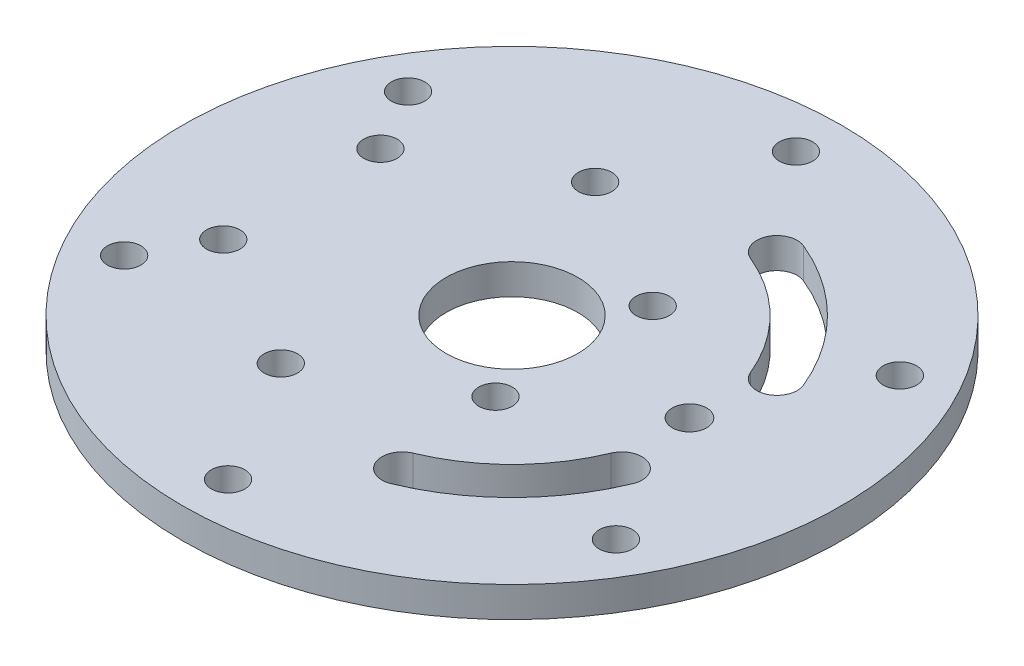
ISO-10303-21;
HEADER;
FILE_DESCRIPTION(('STEP AP214'),'2;1');
FILE_NAME('part.step','',(''),(''),'','','');
FILE_SCHEMA(('AUTOMOTIVE_DESIGN { 1 0 10303 214 1 1 1 1 }'));
ENDSEC;
DATA;
#1=APPLICATION_CONTEXT('core data for automotive mechanical design processes');
#2=APPLICATION_PROTOCOL_DEFINITION('international standard','automotive_design',2000,#1);
#3=PRODUCT_CONTEXT('',#1,'mechanical');
#4=PRODUCT('Part','Part','',(#3));
#5=PRODUCT_RELATED_PRODUCT_CATEGORY('part','',(#4));
#6=PRODUCT_DEFINITION_FORMATION('','',#4);
#7=PRODUCT_DEFINITION_CONTEXT('part definition',#1,'design');
#8=PRODUCT_DEFINITION('design','',#6,#7);
#9=PRODUCT_DEFINITION_SHAPE('','',#8);
#10=(LENGTH_UNIT() NAMED_UNIT(*) SI_UNIT(.MILLI.,.METRE.));
#11=(NAMED_UNIT(*) PLANE_ANGLE_UNIT() SI_UNIT($,.RADIAN.));
#12=(NAMED_UNIT(*) SI_UNIT($,.STERADIAN.) SOLID_ANGLE_UNIT());
#13=UNCERTAINTY_MEASURE_WITH_UNIT(LENGTH_MEASURE(1.E-05),#10,'distance_accuracy_value','');
#14=(GEOMETRIC_REPRESENTATION_CONTEXT(3) GLOBAL_UNCERTAINTY_ASSIGNED_CONTEXT((#13)) GLOBAL_UNIT_ASSIGNED_CONTEXT((#10,
#11,#12)) REPRESENTATION_CONTEXT('',''));
#15=CARTESIAN_POINT('',(0.,0.,0.));
#16=DIRECTION('',(0.,0.,1.));
#17=DIRECTION('',(1.,0.,0.));
#18=AXIS2_PLACEMENT_3D('',#15,#16,#17);
#19=CARTESIAN_POINT('',(0.,3.,0.));
#20=DIRECTION('',(0.,1.,0.));
#21=DIRECTION('',(0.,0.,1.));
#22=AXIS2_PLACEMENT_3D('',#19,#20,#21);
#23=PLANE('',#22);
#24=CARTESIAN_POINT('',(-24.2487113059625,3.,14.000000000001));
#25=DIRECTION('',(0.,1.,0.));
#26=DIRECTION('',(0.,0.,1.));
#27=AXIS2_PLACEMENT_3D('',#24,#25,#26);
#28=CIRCLE('',#27,1.65);
#29=CARTESIAN_POINT('',(-24.2487113059625,3.,15.650000000001));
#30=VERTEX_POINT('',#29);
#31=EDGE_CURVE('E177',#30,#30,#28,.T.);
#32=ORIENTED_EDGE('',*,*,#31,.F.);
#33=EDGE_LOOP('',(#32));
#34=FACE_BOUND('',#33,.T.);
#35=CARTESIAN_POINT('',(24.2487113059661,3.,13.999999999999));
#36=DIRECTION('',(0.,1.,0.));
#37=DIRECTION('',(0.,0.,1.));
#38=AXIS2_PLACEMENT_3D('',#35,#36,#37);
#39=CIRCLE('',#38,1.65);
#40=CARTESIAN_POINT('',(24.2487113059661,3.,15.649999999999));
#41=VERTEX_POINT('',#40);
#42=EDGE_CURVE('E189',#41,#41,#39,.T.);
#43=ORIENTED_EDGE('',*,*,#42,.F.);
#44=EDGE_LOOP('',(#43));
#45=FACE_BOUND('',#44,.T.);
#46=CARTESIAN_POINT('',(0.,3.,-28.));
#47=DIRECTION('',(0.,1.,0.));
#48=DIRECTION('',(0.,0.,1.));
#49=AXIS2_PLACEMENT_3D('',#46,#47,#48);
#50=CIRCLE('',#49,1.65);
#51=CARTESIAN_POINT('',(0.,3.,-26.35));
#52=VERTEX_POINT('',#51);
#53=EDGE_CURVE('E201',#52,#52,#50,.T.);
#54=ORIENTED_EDGE('',*,*,#53,.F.);
#55=EDGE_LOOP('',(#54));
#56=FACE_BOUND('',#55,.T.);
#57=CARTESIAN_POINT('',(-20.7233937586582,3.,-7.74999999999993));
#58=DIRECTION('',(0.,1.,0.));
#59=DIRECTION('',(0.,0.,1.));
#60=AXIS2_PLACEMENT_3D('',#57,#58,#59);
#61=CIRCLE('',#60,1.65);
#62=CARTESIAN_POINT('',(-20.7233937586582,3.,-6.09999999999993));
#63=VERTEX_POINT('',#62);
#64=EDGE_CURVE('E213',#63,#63,#61,.T.);
#65=ORIENTED_EDGE('',*,*,#64,.F.);
#66=EDGE_LOOP('',(#65));
#67=FACE_BOUND('',#66,.T.);
#68=CARTESIAN_POINT('',(-7.29999999999924,3.,15.4999999999994));
#69=DIRECTION('',(0.,1.,0.));
#70=DIRECTION('',(0.,0.,1.));
#71=AXIS2_PLACEMENT_3D('',#68,#69,#70);
#72=CIRCLE('',#71,1.65);
#73=CARTESIAN_POINT('',(-7.29999999999924,3.,17.1499999999994));
#74=VERTEX_POINT('',#73);
#75=EDGE_CURVE('E225',#74,#74,#72,.T.);
#76=ORIENTED_EDGE('',*,*,#75,.F.);
#77=EDGE_LOOP('',(#76));
#78=FACE_BOUND('',#77,.T.);
#79=CARTESIAN_POINT('',(6.12339375865876,3.,-7.7500000000005));
#80=DIRECTION('',(0.,1.,0.));
#81=DIRECTION('',(0.,0.,1.));
#82=AXIS2_PLACEMENT_3D('',#79,#80,#81);
#83=CIRCLE('',#82,1.65);
#84=CARTESIAN_POINT('',(6.12339375865876,3.,-6.1000000000005));
#85=VERTEX_POINT('',#84);
#86=EDGE_CURVE('E237',#85,#85,#83,.T.);
#87=ORIENTED_EDGE('',*,*,#86,.F.);
#88=EDGE_LOOP('',(#87));
#89=FACE_BOUND('',#88,.T.);
#90=CARTESIAN_POINT('',(0.,3.,0.));
#91=DIRECTION('',(0.,1.,0.));
#92=DIRECTION('',(0.,0.,1.));
#93=AXIS2_PLACEMENT_3D('',#90,#91,#92);
#94=CIRCLE('',#93,6.5);
#95=CARTESIAN_POINT('',(0.,3.,6.5));
#96=VERTEX_POINT('',#95);
#97=EDGE_CURVE('E250',#96,#96,#94,.T.);
#98=ORIENTED_EDGE('',*,*,#97,.F.);
#99=EDGE_LOOP('',(#98));
#100=FACE_BOUND('',#99,.T.);
#101=CARTESIAN_POINT('',(0.,3.,0.));
#102=DIRECTION('',(0.,1.,0.));
#103=DIRECTION('',(0.,0.,1.));
#104=AXIS2_PLACEMENT_3D('',#101,#102,#103);
#105=CIRCLE('',#104,32.5);
#106=CARTESIAN_POINT('',(0.,3.,32.5));
#107=VERTEX_POINT('',#106);
#108=EDGE_CURVE('E11',#107,#107,#105,.T.);
#109=ORIENTED_EDGE('',*,*,#108,.T.);
#110=EDGE_LOOP('',(#109));
#111=FACE_BOUND('',#110,.T.);
#112=CARTESIAN_POINT('',(-7.30000000000001,3.,-15.5));
#113=DIRECTION('',(0.,1.,0.));
#114=DIRECTION('',(0.,0.,1.));
#115=AXIS2_PLACEMENT_3D('',#112,#113,#114);
#116=CIRCLE('',#115,1.65);
#117=CARTESIAN_POINT('',(-7.30000000000001,3.,-13.85));
#118=VERTEX_POINT('',#117);
#119=EDGE_CURVE('E243',#118,#118,#116,.T.);
#120=ORIENTED_EDGE('',*,*,#119,.F.);
#121=EDGE_LOOP('',(#120));
#122=FACE_BOUND('',#121,.T.);
#123=CARTESIAN_POINT('',(6.12339375865915,3.,7.74999999999923));
#124=DIRECTION('',(0.,1.,0.));
#125=DIRECTION('',(0.,0.,1.));
#126=AXIS2_PLACEMENT_3D('',#123,#124,#125);
#127=CIRCLE('',#126,1.65);
#128=CARTESIAN_POINT('',(6.12339375865915,3.,9.39999999999923));
#129=VERTEX_POINT('',#128);
#130=EDGE_CURVE('E231',#129,#129,#127,.T.);
#131=ORIENTED_EDGE('',*,*,#130,.F.);
#132=EDGE_LOOP('',(#131));
#133=FACE_BOUND('',#132,.T.);
#134=CARTESIAN_POINT('',(-20.723393758658,3.,7.7499999999998));
#135=DIRECTION('',(0.,1.,0.));
#136=DIRECTION('',(0.,0.,1.));
#137=AXIS2_PLACEMENT_3D('',#134,#135,#136);
#138=CIRCLE('',#137,1.65);
#139=CARTESIAN_POINT('',(-20.723393758658,3.,9.3999999999998));
#140=VERTEX_POINT('',#139);
#141=EDGE_CURVE('E219',#140,#140,#138,.T.);
#142=ORIENTED_EDGE('',*,*,#141,.F.);
#143=EDGE_LOOP('',(#142));
#144=FACE_BOUND('',#143,.T.);
#145=CARTESIAN_POINT('',(17.5,3.,0.));
#146=DIRECTION('',(0.,1.,0.));
#147=DIRECTION('',(0.,0.,1.));
#148=AXIS2_PLACEMENT_3D('',#145,#146,#147);
#149=CIRCLE('',#148,1.7);
#150=CARTESIAN_POINT('',(17.5,3.,1.7));
#151=VERTEX_POINT('',#150);
#152=EDGE_CURVE('E207',#151,#151,#149,.T.);
#153=ORIENTED_EDGE('',*,*,#152,.F.);
#154=EDGE_LOOP('',(#153));
#155=FACE_BOUND('',#154,.T.);
#156=CARTESIAN_POINT('',(24.2487113059649,3.,-14.000000000001));
#157=DIRECTION('',(0.,1.,0.));
#158=DIRECTION('',(0.,0.,1.));
#159=AXIS2_PLACEMENT_3D('',#156,#157,#158);
#160=CIRCLE('',#159,1.65);
#161=CARTESIAN_POINT('',(24.2487113059649,3.,-12.350000000001));
#162=VERTEX_POINT('',#161);
#163=EDGE_CURVE('E195',#162,#162,#160,.T.);
#164=ORIENTED_EDGE('',*,*,#163,.F.);
#165=EDGE_LOOP('',(#164));
#166=FACE_BOUND('',#165,.T.);
#167=CARTESIAN_POINT('',(2.37511124223193E-12,3.,28.));
#168=DIRECTION('',(0.,1.,0.));
#169=DIRECTION('',(0.,0.,1.));
#170=AXIS2_PLACEMENT_3D('',#167,#168,#169);
#171=CIRCLE('',#170,1.65);
#172=CARTESIAN_POINT('',(2.37511124223193E-12,3.,29.65));
#173=VERTEX_POINT('',#172);
#174=EDGE_CURVE('E183',#173,#173,#171,.T.);
#175=ORIENTED_EDGE('',*,*,#174,.F.);
#176=EDGE_LOOP('',(#175));
#177=FACE_BOUND('',#176,.T.);
#178=CARTESIAN_POINT('',(-24.2487113059637,3.,-13.999999999999));
#179=DIRECTION('',(0.,1.,0.));
#180=DIRECTION('',(0.,0.,1.));
#181=AXIS2_PLACEMENT_3D('',#178,#179,#180);
#182=CIRCLE('',#181,1.65);
#183=CARTESIAN_POINT('',(-24.2487113059637,3.,-12.349999999999));
#184=VERTEX_POINT('',#183);
#185=EDGE_CURVE('E171',#184,#184,#182,.T.);
#186=ORIENTED_EDGE('',*,*,#185,.F.);
#187=EDGE_LOOP('',(#186));
#188=FACE_BOUND('',#187,.T.);
#189=CARTESIAN_POINT('',(0.,3.,0.));
#190=DIRECTION('',(0.,1.,0.));
#191=DIRECTION('',(0.,0.,1.));
#192=AXIS2_PLACEMENT_3D('',#189,#190,#191);
#193=CIRCLE('',#192,22.);
#194=CARTESIAN_POINT('',(8.41903551203221,3.,20.3253497152482));
#195=VERTEX_POINT('',#194);
#196=CARTESIAN_POINT('',(20.3253497152484,3.,8.41903551203173));
#197=VERTEX_POINT('',#196);
#198=EDGE_CURVE('E142',#195,#197,#193,.T.);
#199=ORIENTED_EDGE('',*,*,#198,.F.);
#200=CARTESIAN_POINT('',(7.65366864730201,3.,18.4775906502256));
#201=DIRECTION('',(0.,1.,0.));
#202=DIRECTION('',(0.,0.,1.));
#203=AXIS2_PLACEMENT_3D('',#200,#201,#202);
#204=CIRCLE('',#203,2.);
#205=CARTESIAN_POINT('',(6.88830178257181,3.,16.6298315852031));
#206=VERTEX_POINT('',#205);
#207=EDGE_CURVE('E140',#206,#195,#204,.T.);
#208=ORIENTED_EDGE('',*,*,#207,.F.);
#209=CARTESIAN_POINT('',(0.,3.,0.));
#210=DIRECTION('',(0.,-1.,0.));
#211=DIRECTION('',(0.,0.,1.));
#212=AXIS2_PLACEMENT_3D('',#209,#210,#211);
#213=CIRCLE('',#212,18.);
#214=CARTESIAN_POINT('',(16.6298315852032,3.,6.88830178257142));
#215=VERTEX_POINT('',#214);
#216=EDGE_CURVE('E148',#215,#206,#213,.T.);
#217=ORIENTED_EDGE('',*,*,#216,.F.);
#218=CARTESIAN_POINT('',(18.4775906502258,3.,7.65366864730156));
#219=DIRECTION('',(0.,1.,0.));
#220=DIRECTION('',(0.,0.,1.));
#221=AXIS2_PLACEMENT_3D('',#218,#219,#220);
#222=CIRCLE('',#221,2.);
#223=EDGE_CURVE('E145',#197,#215,#222,.T.);
#224=ORIENTED_EDGE('',*,*,#223,.F.);
#225=EDGE_LOOP('',(#199,#208,#217,#224));
#226=FACE_BOUND('',#225,.T.);
#227=CARTESIAN_POINT('',(0.,3.,0.));
#228=DIRECTION('',(0.,-1.,0.));
#229=DIRECTION('',(0.,0.,-1.));
#230=AXIS2_PLACEMENT_3D('',#227,#228,#229);
#231=CIRCLE('',#230,18.);
#232=CARTESIAN_POINT('',(6.88830178257181,3.,-16.6298315852031));
#233=VERTEX_POINT('',#232);
#234=CARTESIAN_POINT('',(16.6298315852032,3.,-6.88830178257142));
#235=VERTEX_POINT('',#234);
#236=EDGE_CURVE('E112',#233,#235,#231,.T.);
#237=ORIENTED_EDGE('',*,*,#236,.F.);
#238=CARTESIAN_POINT('',(7.65366864730201,3.,-18.4775906502256));
#239=DIRECTION('',(0.,1.,0.));
#240=DIRECTION('',(0.,0.,-1.));
#241=AXIS2_PLACEMENT_3D('',#238,#239,#240);
#242=CIRCLE('',#241,2.);
#243=CARTESIAN_POINT('',(8.41903551203221,3.,-20.3253497152482));
#244=VERTEX_POINT('',#243);
#245=EDGE_CURVE('E104',#244,#233,#242,.T.);
#246=ORIENTED_EDGE('',*,*,#245,.F.);
#247=CARTESIAN_POINT('',(0.,3.,0.));
#248=DIRECTION('',(0.,1.,0.));
#249=DIRECTION('',(0.,0.,-1.));
#250=AXIS2_PLACEMENT_3D('',#247,#248,#249);
#251=CIRCLE('',#250,22.);
#252=CARTESIAN_POINT('',(20.3253497152484,3.,-8.41903551203173));
#253=VERTEX_POINT('',#252);
#254=EDGE_CURVE('E126',#253,#244,#251,.T.);
#255=ORIENTED_EDGE('',*,*,#254,.F.);
#256=CARTESIAN_POINT('',(18.4775906502258,3.,-7.65366864730156));
#257=DIRECTION('',(0.,1.,0.));
#258=DIRECTION('',(0.,0.,-1.));
#259=AXIS2_PLACEMENT_3D('',#256,#257,#258);
#260=CIRCLE('',#259,2.);
#261=EDGE_CURVE('E124',#235,#253,#260,.T.);
#262=ORIENTED_EDGE('',*,*,#261,.F.);
#263=EDGE_LOOP('',(#237,#246,#255,#262));
#264=FACE_BOUND('',#263,.T.);
#265=ADVANCED_FACE('F39',(#34,#45,#56,#67,#78,#89,#100,#111,#122,#133,#144,#155,#166,#177,#188,
#226,#264),#23,.T.);
#266=CARTESIAN_POINT('',(0.,0.,0.));
#267=DIRECTION('',(0.,1.,0.));
#268=DIRECTION('',(0.,0.,1.));
#269=AXIS2_PLACEMENT_3D('',#266,#267,#268);
#270=PLANE('',#269);
#271=CARTESIAN_POINT('',(7.65366864730201,0.,18.4775906502256));
#272=DIRECTION('',(0.,1.,0.));
#273=DIRECTION('',(0.,0.,1.));
#274=AXIS2_PLACEMENT_3D('',#271,#272,#273);
#275=CIRCLE('',#274,2.);
#276=CARTESIAN_POINT('',(6.88830178257181,0.,16.6298315852031));
#277=VERTEX_POINT('',#276);
#278=CARTESIAN_POINT('',(8.41903551203221,0.,20.3253497152482));
#279=VERTEX_POINT('',#278);
#280=EDGE_CURVE('E120',#277,#279,#275,.T.);
#281=ORIENTED_EDGE('',*,*,#280,.T.);
#282=CARTESIAN_POINT('',(0.,0.,0.));
#283=DIRECTION('',(0.,1.,0.));
#284=DIRECTION('',(0.,0.,1.));
#285=AXIS2_PLACEMENT_3D('',#282,#283,#284);
#286=CIRCLE('',#285,22.);
#287=CARTESIAN_POINT('',(20.3253497152484,0.,8.41903551203173));
#288=VERTEX_POINT('',#287);
#289=EDGE_CURVE('E153',#279,#288,#286,.T.);
#290=ORIENTED_EDGE('',*,*,#289,.T.);
#291=CARTESIAN_POINT('',(18.4775906502258,0.,7.65366864730156));
#292=DIRECTION('',(0.,1.,0.));
#293=DIRECTION('',(0.,0.,1.));
#294=AXIS2_PLACEMENT_3D('',#291,#292,#293);
#295=CIRCLE('',#294,2.);
#296=CARTESIAN_POINT('',(16.6298315852032,0.,6.88830178257142));
#297=VERTEX_POINT('',#296);
#298=EDGE_CURVE('E156',#288,#297,#295,.T.);
#299=ORIENTED_EDGE('',*,*,#298,.T.);
#300=CARTESIAN_POINT('',(0.,0.,0.));
#301=DIRECTION('',(0.,-1.,0.));
#302=DIRECTION('',(0.,0.,1.));
#303=AXIS2_PLACEMENT_3D('',#300,#301,#302);
#304=CIRCLE('',#303,18.);
#305=EDGE_CURVE('E143',#297,#277,#304,.T.);
#306=ORIENTED_EDGE('',*,*,#305,.T.);
#307=EDGE_LOOP('',(#281,#290,#299,#306));
#308=FACE_BOUND('',#307,.T.);
#309=CARTESIAN_POINT('',(0.,0.,0.));
#310=DIRECTION('',(0.,1.,0.));
#311=DIRECTION('',(0.,0.,1.));
#312=AXIS2_PLACEMENT_3D('',#309,#310,#311);
#313=CIRCLE('',#312,32.5);
#314=CARTESIAN_POINT('',(0.,0.,32.5));
#315=VERTEX_POINT('',#314);
#316=EDGE_CURVE('E43',#315,#315,#313,.T.);
#317=ORIENTED_EDGE('',*,*,#316,.F.);
#318=EDGE_LOOP('',(#317));
#319=FACE_BOUND('',#318,.T.);
#320=CARTESIAN_POINT('',(0.,0.,0.));
#321=DIRECTION('',(0.,1.,0.));
#322=DIRECTION('',(0.,0.,1.));
#323=AXIS2_PLACEMENT_3D('',#320,#321,#322);
#324=CIRCLE('',#323,6.5);
#325=CARTESIAN_POINT('',(0.,0.,6.5));
#326=VERTEX_POINT('',#325);
#327=EDGE_CURVE('E247',#326,#326,#324,.T.);
#328=ORIENTED_EDGE('',*,*,#327,.T.);
#329=EDGE_LOOP('',(#328));
#330=FACE_BOUND('',#329,.T.);
#331=CARTESIAN_POINT('',(-7.30000000000001,0.,-15.5));
#332=DIRECTION('',(0.,1.,0.));
#333=DIRECTION('',(0.,0.,1.));
#334=AXIS2_PLACEMENT_3D('',#331,#332,#333);
#335=CIRCLE('',#334,1.65);
#336=CARTESIAN_POINT('',(-7.30000000000001,0.,-13.85));
#337=VERTEX_POINT('',#336);
#338=EDGE_CURVE('E240',#337,#337,#335,.T.);
#339=ORIENTED_EDGE('',*,*,#338,.T.);
#340=EDGE_LOOP('',(#339));
#341=FACE_BOUND('',#340,.T.);
#342=CARTESIAN_POINT('',(6.12339375865876,0.,-7.7500000000005));
#343=DIRECTION('',(0.,1.,0.));
#344=DIRECTION('',(0.,0.,1.));
#345=AXIS2_PLACEMENT_3D('',#342,#343,#344);
#346=CIRCLE('',#345,1.65);
#347=CARTESIAN_POINT('',(6.12339375865876,0.,-6.1000000000005));
#348=VERTEX_POINT('',#347);
#349=EDGE_CURVE('E234',#348,#348,#346,.T.);
#350=ORIENTED_EDGE('',*,*,#349,.T.);
#351=EDGE_LOOP('',(#350));
#352=FACE_BOUND('',#351,.T.);
#353=CARTESIAN_POINT('',(6.12339375865915,0.,7.74999999999923));
#354=DIRECTION('',(0.,1.,0.));
#355=DIRECTION('',(0.,0.,1.));
#356=AXIS2_PLACEMENT_3D('',#353,#354,#355);
#357=CIRCLE('',#356,1.65);
#358=CARTESIAN_POINT('',(6.12339375865915,0.,9.39999999999923));
#359=VERTEX_POINT('',#358);
#360=EDGE_CURVE('E228',#359,#359,#357,.T.);
#361=ORIENTED_EDGE('',*,*,#360,.T.);
#362=EDGE_LOOP('',(#361));
#363=FACE_BOUND('',#362,.T.);
#364=CARTESIAN_POINT('',(-7.29999999999924,0.,15.4999999999994));
#365=DIRECTION('',(0.,1.,0.));
#366=DIRECTION('',(0.,0.,1.));
#367=AXIS2_PLACEMENT_3D('',#364,#365,#366);
#368=CIRCLE('',#367,1.65);
#369=CARTESIAN_POINT('',(-7.29999999999924,0.,17.1499999999994));
#370=VERTEX_POINT('',#369);
#371=EDGE_CURVE('E222',#370,#370,#368,.T.);
#372=ORIENTED_EDGE('',*,*,#371,.T.);
#373=EDGE_LOOP('',(#372));
#374=FACE_BOUND('',#373,.T.);
#375=CARTESIAN_POINT('',(-20.723393758658,0.,7.7499999999998));
#376=DIRECTION('',(0.,1.,0.));
#377=DIRECTION('',(0.,0.,1.));
#378=AXIS2_PLACEMENT_3D('',#375,#376,#377);
#379=CIRCLE('',#378,1.65);
#380=CARTESIAN_POINT('',(-20.723393758658,0.,9.3999999999998));
#381=VERTEX_POINT('',#380);
#382=EDGE_CURVE('E216',#381,#381,#379,.T.);
#383=ORIENTED_EDGE('',*,*,#382,.T.);
#384=EDGE_LOOP('',(#383));
#385=FACE_BOUND('',#384,.T.);
#386=CARTESIAN_POINT('',(-20.7233937586582,0.,-7.74999999999993));
#387=DIRECTION('',(0.,1.,0.));
#388=DIRECTION('',(0.,0.,1.));
#389=AXIS2_PLACEMENT_3D('',#386,#387,#388);
#390=CIRCLE('',#389,1.65);
#391=CARTESIAN_POINT('',(-20.7233937586582,0.,-6.09999999999993));
#392=VERTEX_POINT('',#391);
#393=EDGE_CURVE('E210',#392,#392,#390,.T.);
#394=ORIENTED_EDGE('',*,*,#393,.T.);
#395=EDGE_LOOP('',(#394));
#396=FACE_BOUND('',#395,.T.);
#397=CARTESIAN_POINT('',(17.5,0.,0.));
#398=DIRECTION('',(0.,1.,0.));
#399=DIRECTION('',(0.,0.,1.));
#400=AXIS2_PLACEMENT_3D('',#397,#398,#399);
#401=CIRCLE('',#400,1.7);
#402=CARTESIAN_POINT('',(17.5,0.,1.7));
#403=VERTEX_POINT('',#402);
#404=EDGE_CURVE('E204',#403,#403,#401,.T.);
#405=ORIENTED_EDGE('',*,*,#404,.T.);
#406=EDGE_LOOP('',(#405));
#407=FACE_BOUND('',#406,.T.);
#408=CARTESIAN_POINT('',(0.,0.,-28.));
#409=DIRECTION('',(0.,1.,0.));
#410=DIRECTION('',(0.,0.,1.));
#411=AXIS2_PLACEMENT_3D('',#408,#409,#410);
#412=CIRCLE('',#411,1.65);
#413=CARTESIAN_POINT('',(0.,0.,-26.35));
#414=VERTEX_POINT('',#413);
#415=EDGE_CURVE('E198',#414,#414,#412,.T.);
#416=ORIENTED_EDGE('',*,*,#415,.T.);
#417=EDGE_LOOP('',(#416));
#418=FACE_BOUND('',#417,.T.);
#419=CARTESIAN_POINT('',(24.2487113059649,0.,-14.000000000001));
#420=DIRECTION('',(0.,1.,0.));
#421=DIRECTION('',(0.,0.,1.));
#422=AXIS2_PLACEMENT_3D('',#419,#420,#421);
#423=CIRCLE('',#422,1.65);
#424=CARTESIAN_POINT('',(24.2487113059649,0.,-12.350000000001));
#425=VERTEX_POINT('',#424);
#426=EDGE_CURVE('E192',#425,#425,#423,.T.);
#427=ORIENTED_EDGE('',*,*,#426,.T.);
#428=EDGE_LOOP('',(#427));
#429=FACE_BOUND('',#428,.T.);
#430=CARTESIAN_POINT('',(24.2487113059661,0.,13.999999999999));
#431=DIRECTION('',(0.,1.,0.));
#432=DIRECTION('',(0.,0.,1.));
#433=AXIS2_PLACEMENT_3D('',#430,#431,#432);
#434=CIRCLE('',#433,1.65);
#435=CARTESIAN_POINT('',(24.2487113059661,0.,15.649999999999));
#436=VERTEX_POINT('',#435);
#437=EDGE_CURVE('E186',#436,#436,#434,.T.);
#438=ORIENTED_EDGE('',*,*,#437,.T.);
#439=EDGE_LOOP('',(#438));
#440=FACE_BOUND('',#439,.T.);
#441=CARTESIAN_POINT('',(2.37511124223193E-12,0.,28.));
#442=DIRECTION('',(0.,1.,0.));
#443=DIRECTION('',(0.,0.,1.));
#444=AXIS2_PLACEMENT_3D('',#441,#442,#443);
#445=CIRCLE('',#444,1.65);
#446=CARTESIAN_POINT('',(2.37511124223193E-12,0.,29.65));
#447=VERTEX_POINT('',#446);
#448=EDGE_CURVE('E180',#447,#447,#445,.T.);
#449=ORIENTED_EDGE('',*,*,#448,.T.);
#450=EDGE_LOOP('',(#449));
#451=FACE_BOUND('',#450,.T.);
#452=CARTESIAN_POINT('',(-24.2487113059625,0.,14.000000000001));
#453=DIRECTION('',(0.,1.,0.));
#454=DIRECTION('',(0.,0.,1.));
#455=AXIS2_PLACEMENT_3D('',#452,#453,#454);
#456=CIRCLE('',#455,1.65);
#457=CARTESIAN_POINT('',(-24.2487113059625,0.,15.650000000001));
#458=VERTEX_POINT('',#457);
#459=EDGE_CURVE('E174',#458,#458,#456,.T.);
#460=ORIENTED_EDGE('',*,*,#459,.T.);
#461=EDGE_LOOP('',(#460));
#462=FACE_BOUND('',#461,.T.);
#463=CARTESIAN_POINT('',(-24.2487113059637,0.,-13.999999999999));
#464=DIRECTION('',(0.,1.,0.));
#465=DIRECTION('',(0.,0.,1.));
#466=AXIS2_PLACEMENT_3D('',#463,#464,#465);
#467=CIRCLE('',#466,1.65);
#468=CARTESIAN_POINT('',(-24.2487113059637,0.,-12.349999999999));
#469=VERTEX_POINT('',#468);
#470=EDGE_CURVE('E170',#469,#469,#467,.T.);
#471=ORIENTED_EDGE('',*,*,#470,.T.);
#472=EDGE_LOOP('',(#471));
#473=FACE_BOUND('',#472,.T.);
#474=CARTESIAN_POINT('',(7.65366864730201,0.,-18.4775906502256));
#475=DIRECTION('',(0.,1.,0.));
#476=DIRECTION('',(0.,0.,-1.));
#477=AXIS2_PLACEMENT_3D('',#474,#475,#476);
#478=CIRCLE('',#477,2.);
#479=CARTESIAN_POINT('',(8.41903551203221,0.,-20.3253497152482));
#480=VERTEX_POINT('',#479);
#481=CARTESIAN_POINT('',(6.88830178257181,0.,-16.6298315852031));
#482=VERTEX_POINT('',#481);
#483=EDGE_CURVE('E62',#480,#482,#478,.T.);
#484=ORIENTED_EDGE('',*,*,#483,.T.);
#485=CARTESIAN_POINT('',(0.,0.,0.));
#486=DIRECTION('',(0.,-1.,0.));
#487=DIRECTION('',(0.,0.,-1.));
#488=AXIS2_PLACEMENT_3D('',#485,#486,#487);
#489=CIRCLE('',#488,18.);
#490=CARTESIAN_POINT('',(16.6298315852032,0.,-6.88830178257142));
#491=VERTEX_POINT('',#490);
#492=EDGE_CURVE('E119',#482,#491,#489,.T.);
#493=ORIENTED_EDGE('',*,*,#492,.T.);
#494=CARTESIAN_POINT('',(18.4775906502258,0.,-7.65366864730156));
#495=DIRECTION('',(0.,1.,0.));
#496=DIRECTION('',(0.,0.,-1.));
#497=AXIS2_PLACEMENT_3D('',#494,#495,#496);
#498=CIRCLE('',#497,2.);
#499=CARTESIAN_POINT('',(20.3253497152484,0.,-8.41903551203173));
#500=VERTEX_POINT('',#499);
#501=EDGE_CURVE('E132',#491,#500,#498,.T.);
#502=ORIENTED_EDGE('',*,*,#501,.T.);
#503=CARTESIAN_POINT('',(0.,0.,0.));
#504=DIRECTION('',(0.,1.,0.));
#505=DIRECTION('',(0.,0.,-1.));
#506=AXIS2_PLACEMENT_3D('',#503,#504,#505);
#507=CIRCLE('',#506,22.);
#508=EDGE_CURVE('E113',#500,#480,#507,.T.);
#509=ORIENTED_EDGE('',*,*,#508,.T.);
#510=EDGE_LOOP('',(#484,#493,#502,#509));
#511=FACE_BOUND('',#510,.T.);
#512=ADVANCED_FACE('F256',(#308,#319,#330,#341,#352,#363,#374,#385,#396,#407,#418,#429,#440,
#451,#462,#473,#511),#270,.F.);
#513=CARTESIAN_POINT('',(0.,3.,0.));
#514=DIRECTION('',(0.,-1.,0.));
#515=DIRECTION('',(0.,0.,-1.));
#516=AXIS2_PLACEMENT_3D('',#513,#514,#515);
#517=CYLINDRICAL_SURFACE('',#516,32.5);
#518=ORIENTED_EDGE('',*,*,#108,.F.);
#519=EDGE_LOOP('',(#518));
#520=FACE_BOUND('',#519,.T.);
#521=ORIENTED_EDGE('',*,*,#316,.T.);
#522=EDGE_LOOP('',(#521));
#523=FACE_BOUND('',#522,.T.);
#524=ADVANCED_FACE('F41',(#520,#523),#517,.T.);
#525=CARTESIAN_POINT('',(0.,3.,0.));
#526=DIRECTION('',(0.,-1.,0.));
#527=DIRECTION('',(0.,0.,-1.));
#528=AXIS2_PLACEMENT_3D('',#525,#526,#527);
#529=CYLINDRICAL_SURFACE('',#528,6.5);
#530=ORIENTED_EDGE('',*,*,#97,.T.);
#531=EDGE_LOOP('',(#530));
#532=FACE_BOUND('',#531,.T.);
#533=ORIENTED_EDGE('',*,*,#327,.F.);
#534=EDGE_LOOP('',(#533));
#535=FACE_BOUND('',#534,.T.);
#536=ADVANCED_FACE('F259',(#532,#535),#529,.F.);
#537=CARTESIAN_POINT('',(-7.30000000000001,3.,-15.5));
#538=DIRECTION('',(0.,-1.,0.));
#539=DIRECTION('',(0.,0.,-1.));
#540=AXIS2_PLACEMENT_3D('',#537,#538,#539);
#541=CYLINDRICAL_SURFACE('',#540,1.65);
#542=ORIENTED_EDGE('',*,*,#119,.T.);
#543=EDGE_LOOP('',(#542));
#544=FACE_BOUND('',#543,.T.);
#545=ORIENTED_EDGE('',*,*,#338,.F.);
#546=EDGE_LOOP('',(#545));
#547=FACE_BOUND('',#546,.T.);
#548=ADVANCED_FACE('F261',(#544,#547),#541,.F.);
#549=CARTESIAN_POINT('',(6.12339375865876,3.,-7.7500000000005));
#550=DIRECTION('',(0.,-1.,0.));
#551=DIRECTION('',(0.,0.,-1.));
#552=AXIS2_PLACEMENT_3D('',#549,#550,#551);
#553=CYLINDRICAL_SURFACE('',#552,1.65);
#554=ORIENTED_EDGE('',*,*,#86,.T.);
#555=EDGE_LOOP('',(#554));
#556=FACE_BOUND('',#555,.T.);
#557=ORIENTED_EDGE('',*,*,#349,.F.);
#558=EDGE_LOOP('',(#557));
#559=FACE_BOUND('',#558,.T.);
#560=ADVANCED_FACE('F268',(#556,#559),#553,.F.);
#561=CARTESIAN_POINT('',(6.12339375865915,3.,7.74999999999923));
#562=DIRECTION('',(0.,-1.,0.));
#563=DIRECTION('',(0.,0.,-1.));
#564=AXIS2_PLACEMENT_3D('',#561,#562,#563);
#565=CYLINDRICAL_SURFACE('',#564,1.65);
#566=ORIENTED_EDGE('',*,*,#130,.T.);
#567=EDGE_LOOP('',(#566));
#568=FACE_BOUND('',#567,.T.);
#569=ORIENTED_EDGE('',*,*,#360,.F.);
#570=EDGE_LOOP('',(#569));
#571=FACE_BOUND('',#570,.T.);
#572=ADVANCED_FACE('F380',(#568,#571),#565,.F.);
#573=CARTESIAN_POINT('',(-7.29999999999924,3.,15.4999999999994));
#574=DIRECTION('',(0.,-1.,0.));
#575=DIRECTION('',(0.,0.,-1.));
#576=AXIS2_PLACEMENT_3D('',#573,#574,#575);
#577=CYLINDRICAL_SURFACE('',#576,1.65);
#578=ORIENTED_EDGE('',*,*,#75,.T.);
#579=EDGE_LOOP('',(#578));
#580=FACE_BOUND('',#579,.T.);
#581=ORIENTED_EDGE('',*,*,#371,.F.);
#582=EDGE_LOOP('',(#581));
#583=FACE_BOUND('',#582,.T.);
#584=ADVANCED_FACE('F376',(#580,#583),#577,.F.);
#585=CARTESIAN_POINT('',(-20.723393758658,3.,7.7499999999998));
#586=DIRECTION('',(0.,-1.,0.));
#587=DIRECTION('',(0.,0.,-1.));
#588=AXIS2_PLACEMENT_3D('',#585,#586,#587);
#589=CYLINDRICAL_SURFACE('',#588,1.65);
#590=ORIENTED_EDGE('',*,*,#141,.T.);
#591=EDGE_LOOP('',(#590));
#592=FACE_BOUND('',#591,.T.);
#593=ORIENTED_EDGE('',*,*,#382,.F.);
#594=EDGE_LOOP('',(#593));
#595=FACE_BOUND('',#594,.T.);
#596=ADVANCED_FACE('F372',(#592,#595),#589,.F.);
#597=CARTESIAN_POINT('',(-20.7233937586582,3.,-7.74999999999993));
#598=DIRECTION('',(0.,-1.,0.));
#599=DIRECTION('',(0.,0.,-1.));
#600=AXIS2_PLACEMENT_3D('',#597,#598,#599);
#601=CYLINDRICAL_SURFACE('',#600,1.65);
#602=ORIENTED_EDGE('',*,*,#64,.T.);
#603=EDGE_LOOP('',(#602));
#604=FACE_BOUND('',#603,.T.);
#605=ORIENTED_EDGE('',*,*,#393,.F.);
#606=EDGE_LOOP('',(#605));
#607=FACE_BOUND('',#606,.T.);
#608=ADVANCED_FACE('F368',(#604,#607),#601,.F.);
#609=CARTESIAN_POINT('',(17.5,3.,0.));
#610=DIRECTION('',(0.,-1.,0.));
#611=DIRECTION('',(0.,0.,-1.));
#612=AXIS2_PLACEMENT_3D('',#609,#610,#611);
#613=CYLINDRICAL_SURFACE('',#612,1.7);
#614=ORIENTED_EDGE('',*,*,#152,.T.);
#615=EDGE_LOOP('',(#614));
#616=FACE_BOUND('',#615,.T.);
#617=ORIENTED_EDGE('',*,*,#404,.F.);
#618=EDGE_LOOP('',(#617));
#619=FACE_BOUND('',#618,.T.);
#620=ADVANCED_FACE('F364',(#616,#619),#613,.F.);
#621=CARTESIAN_POINT('',(0.,3.,-28.));
#622=DIRECTION('',(0.,-1.,0.));
#623=DIRECTION('',(0.,0.,-1.));
#624=AXIS2_PLACEMENT_3D('',#621,#622,#623);
#625=CYLINDRICAL_SURFACE('',#624,1.65);
#626=ORIENTED_EDGE('',*,*,#53,.T.);
#627=EDGE_LOOP('',(#626));
#628=FACE_BOUND('',#627,.T.);
#629=ORIENTED_EDGE('',*,*,#415,.F.);
#630=EDGE_LOOP('',(#629));
#631=FACE_BOUND('',#630,.T.);
#632=ADVANCED_FACE('F360',(#628,#631),#625,.F.);
#633=CARTESIAN_POINT('',(24.2487113059649,3.,-14.000000000001));
#634=DIRECTION('',(0.,-1.,0.));
#635=DIRECTION('',(0.,0.,-1.));
#636=AXIS2_PLACEMENT_3D('',#633,#634,#635);
#637=CYLINDRICAL_SURFACE('',#636,1.65);
#638=ORIENTED_EDGE('',*,*,#163,.T.);
#639=EDGE_LOOP('',(#638));
#640=FACE_BOUND('',#639,.T.);
#641=ORIENTED_EDGE('',*,*,#426,.F.);
#642=EDGE_LOOP('',(#641));
#643=FACE_BOUND('',#642,.T.);
#644=ADVANCED_FACE('F356',(#640,#643),#637,.F.);
#645=CARTESIAN_POINT('',(24.2487113059661,3.,13.999999999999));
#646=DIRECTION('',(0.,-1.,0.));
#647=DIRECTION('',(0.,0.,-1.));
#648=AXIS2_PLACEMENT_3D('',#645,#646,#647);
#649=CYLINDRICAL_SURFACE('',#648,1.65);
#650=ORIENTED_EDGE('',*,*,#42,.T.);
#651=EDGE_LOOP('',(#650));
#652=FACE_BOUND('',#651,.T.);
#653=ORIENTED_EDGE('',*,*,#437,.F.);
#654=EDGE_LOOP('',(#653));
#655=FACE_BOUND('',#654,.T.);
#656=ADVANCED_FACE('F352',(#652,#655),#649,.F.);
#657=CARTESIAN_POINT('',(2.37511124223193E-12,3.,28.));
#658=DIRECTION('',(0.,-1.,0.));
#659=DIRECTION('',(0.,0.,-1.));
#660=AXIS2_PLACEMENT_3D('',#657,#658,#659);
#661=CYLINDRICAL_SURFACE('',#660,1.65);
#662=ORIENTED_EDGE('',*,*,#174,.T.);
#663=EDGE_LOOP('',(#662));
#664=FACE_BOUND('',#663,.T.);
#665=ORIENTED_EDGE('',*,*,#448,.F.);
#666=EDGE_LOOP('',(#665));
#667=FACE_BOUND('',#666,.T.);
#668=ADVANCED_FACE('F348',(#664,#667),#661,.F.);
#669=CARTESIAN_POINT('',(-24.2487113059625,3.,14.000000000001));
#670=DIRECTION('',(0.,-1.,0.));
#671=DIRECTION('',(0.,0.,-1.));
#672=AXIS2_PLACEMENT_3D('',#669,#670,#671);
#673=CYLINDRICAL_SURFACE('',#672,1.65);
#674=ORIENTED_EDGE('',*,*,#31,.T.);
#675=EDGE_LOOP('',(#674));
#676=FACE_BOUND('',#675,.T.);
#677=ORIENTED_EDGE('',*,*,#459,.F.);
#678=EDGE_LOOP('',(#677));
#679=FACE_BOUND('',#678,.T.);
#680=ADVANCED_FACE('F344',(#676,#679),#673,.F.);
#681=CARTESIAN_POINT('',(-24.2487113059637,3.,-13.999999999999));
#682=DIRECTION('',(0.,-1.,0.));
#683=DIRECTION('',(0.,0.,-1.));
#684=AXIS2_PLACEMENT_3D('',#681,#682,#683);
#685=CYLINDRICAL_SURFACE('',#684,1.65);
#686=ORIENTED_EDGE('',*,*,#185,.T.);
#687=EDGE_LOOP('',(#686));
#688=FACE_BOUND('',#687,.T.);
#689=ORIENTED_EDGE('',*,*,#470,.F.);
#690=EDGE_LOOP('',(#689));
#691=FACE_BOUND('',#690,.T.);
#692=ADVANCED_FACE('F341',(#688,#691),#685,.F.);
#693=CARTESIAN_POINT('',(7.65366864730201,3.,18.4775906502256));
#694=DIRECTION('',(0.,-1.,0.));
#695=DIRECTION('',(0.,0.,-1.));
#696=AXIS2_PLACEMENT_3D('',#693,#694,#695);
#697=CYLINDRICAL_SURFACE('',#696,2.);
#698=ORIENTED_EDGE('',*,*,#280,.F.);
#699=DIRECTION('',(0.,-1.,0.));
#700=VECTOR('',#699,1.);
#701=CARTESIAN_POINT('',(6.88830178257181,3.,16.6298315852031));
#702=LINE('',#701,#700);
#703=EDGE_CURVE('E150',#206,#277,#702,.T.);
#704=ORIENTED_EDGE('',*,*,#703,.F.);
#705=ORIENTED_EDGE('',*,*,#207,.T.);
#706=DIRECTION('',(0.,-1.,0.));
#707=VECTOR('',#706,1.);
#708=CARTESIAN_POINT('',(8.41903551203221,3.,20.3253497152482));
#709=LINE('',#708,#707);
#710=EDGE_CURVE('E167',#195,#279,#709,.T.);
#711=ORIENTED_EDGE('',*,*,#710,.T.);
#712=EDGE_LOOP('',(#698,#704,#705,#711));
#713=FACE_BOUND('',#712,.T.);
#714=ADVANCED_FACE('F323',(#713),#697,.F.);
#715=CARTESIAN_POINT('',(0.,3.,0.));
#716=DIRECTION('',(0.,-1.,0.));
#717=DIRECTION('',(0.,0.,-1.));
#718=AXIS2_PLACEMENT_3D('',#715,#716,#717);
#719=CYLINDRICAL_SURFACE('',#718,22.);
#720=ORIENTED_EDGE('',*,*,#289,.F.);
#721=ORIENTED_EDGE('',*,*,#710,.F.);
#722=ORIENTED_EDGE('',*,*,#198,.T.);
#723=DIRECTION('',(0.,-1.,0.));
#724=VECTOR('',#723,1.);
#725=CARTESIAN_POINT('',(20.3253497152484,3.,8.41903551203173));
#726=LINE('',#725,#724);
#727=EDGE_CURVE('E165',#197,#288,#726,.T.);
#728=ORIENTED_EDGE('',*,*,#727,.T.);
#729=EDGE_LOOP('',(#720,#721,#722,#728));
#730=FACE_BOUND('',#729,.T.);
#731=ADVANCED_FACE('F316',(#730),#719,.F.);
#732=CARTESIAN_POINT('',(18.4775906502258,3.,7.65366864730156));
#733=DIRECTION('',(0.,-1.,0.));
#734=DIRECTION('',(0.,0.,-1.));
#735=AXIS2_PLACEMENT_3D('',#732,#733,#734);
#736=CYLINDRICAL_SURFACE('',#735,2.);
#737=ORIENTED_EDGE('',*,*,#298,.F.);
#738=ORIENTED_EDGE('',*,*,#727,.F.);
#739=ORIENTED_EDGE('',*,*,#223,.T.);
#740=DIRECTION('',(0.,-1.,0.));
#741=VECTOR('',#740,1.);
#742=CARTESIAN_POINT('',(16.6298315852032,3.,6.88830178257142));
#743=LINE('',#742,#741);
#744=EDGE_CURVE('E163',#215,#297,#743,.T.);
#745=ORIENTED_EDGE('',*,*,#744,.T.);
#746=EDGE_LOOP('',(#737,#738,#739,#745));
#747=FACE_BOUND('',#746,.T.);
#748=ADVANCED_FACE('F319',(#747),#736,.F.);
#749=CARTESIAN_POINT('',(0.,3.,0.));
#750=DIRECTION('',(0.,-1.,0.));
#751=DIRECTION('',(0.,0.,-1.));
#752=AXIS2_PLACEMENT_3D('',#749,#750,#751);
#753=CYLINDRICAL_SURFACE('',#752,18.);
#754=ORIENTED_EDGE('',*,*,#305,.F.);
#755=ORIENTED_EDGE('',*,*,#744,.F.);
#756=ORIENTED_EDGE('',*,*,#216,.T.);
#757=ORIENTED_EDGE('',*,*,#703,.T.);
#758=EDGE_LOOP('',(#754,#755,#756,#757));
#759=FACE_BOUND('',#758,.T.);
#760=ADVANCED_FACE('F326',(#759),#753,.T.);
#761=CARTESIAN_POINT('',(7.65366864730201,3.,-18.4775906502256));
#762=DIRECTION('',(0.,-1.,0.));
#763=DIRECTION('',(0.,0.,-1.));
#764=AXIS2_PLACEMENT_3D('',#761,#762,#763);
#765=CYLINDRICAL_SURFACE('',#764,2.);
#766=ORIENTED_EDGE('',*,*,#483,.F.);
#767=DIRECTION('',(0.,-1.,0.));
#768=VECTOR('',#767,1.);
#769=CARTESIAN_POINT('',(8.41903551203221,3.,-20.3253497152482));
#770=LINE('',#769,#768);
#771=EDGE_CURVE('E108',#244,#480,#770,.T.);
#772=ORIENTED_EDGE('',*,*,#771,.F.);
#773=ORIENTED_EDGE('',*,*,#245,.T.);
#774=DIRECTION('',(0.,-1.,0.));
#775=VECTOR('',#774,1.);
#776=CARTESIAN_POINT('',(6.88830178257181,3.,-16.6298315852031));
#777=LINE('',#776,#775);
#778=EDGE_CURVE('E107',#233,#482,#777,.T.);
#779=ORIENTED_EDGE('',*,*,#778,.T.);
#780=EDGE_LOOP('',(#766,#772,#773,#779));
#781=FACE_BOUND('',#780,.T.);
#782=ADVANCED_FACE('F106',(#781),#765,.F.);
#783=CARTESIAN_POINT('',(0.,3.,0.));
#784=DIRECTION('',(0.,-1.,0.));
#785=DIRECTION('',(0.,0.,-1.));
#786=AXIS2_PLACEMENT_3D('',#783,#784,#785);
#787=CYLINDRICAL_SURFACE('',#786,18.);
#788=ORIENTED_EDGE('',*,*,#492,.F.);
#789=ORIENTED_EDGE('',*,*,#778,.F.);
#790=ORIENTED_EDGE('',*,*,#236,.T.);
#791=DIRECTION('',(0.,-1.,0.));
#792=VECTOR('',#791,1.);
#793=CARTESIAN_POINT('',(16.6298315852032,3.,-6.88830178257142));
#794=LINE('',#793,#792);
#795=EDGE_CURVE('E121',#235,#491,#794,.T.);
#796=ORIENTED_EDGE('',*,*,#795,.T.);
#797=EDGE_LOOP('',(#788,#789,#790,#796));
#798=FACE_BOUND('',#797,.T.);
#799=ADVANCED_FACE('F116',(#798),#787,.T.);
#800=CARTESIAN_POINT('',(18.4775906502258,3.,-7.65366864730156));
#801=DIRECTION('',(0.,-1.,0.));
#802=DIRECTION('',(0.,0.,-1.));
#803=AXIS2_PLACEMENT_3D('',#800,#801,#802);
#804=CYLINDRICAL_SURFACE('',#803,2.);
#805=ORIENTED_EDGE('',*,*,#501,.F.);
#806=ORIENTED_EDGE('',*,*,#795,.F.);
#807=ORIENTED_EDGE('',*,*,#261,.T.);
#808=DIRECTION('',(0.,-1.,0.));
#809=VECTOR('',#808,1.);
#810=CARTESIAN_POINT('',(20.3253497152484,3.,-8.41903551203173));
#811=LINE('',#810,#809);
#812=EDGE_CURVE('E54',#253,#500,#811,.T.);
#813=ORIENTED_EDGE('',*,*,#812,.T.);
#814=EDGE_LOOP('',(#805,#806,#807,#813));
#815=FACE_BOUND('',#814,.T.);
#816=ADVANCED_FACE('F418',(#815),#804,.F.);
#817=CARTESIAN_POINT('',(0.,3.,0.));
#818=DIRECTION('',(0.,-1.,0.));
#819=DIRECTION('',(0.,0.,-1.));
#820=AXIS2_PLACEMENT_3D('',#817,#818,#819);
#821=CYLINDRICAL_SURFACE('',#820,22.);
#822=ORIENTED_EDGE('',*,*,#508,.F.);
#823=ORIENTED_EDGE('',*,*,#812,.F.);
#824=ORIENTED_EDGE('',*,*,#254,.T.);
#825=ORIENTED_EDGE('',*,*,#771,.T.);
#826=EDGE_LOOP('',(#822,#823,#824,#825));
#827=FACE_BOUND('',#826,.T.);
#828=ADVANCED_FACE('F416',(#827),#821,.F.);
#829=CLOSED_SHELL('',(#265,#512,#524,#536,#548,#560,#572,#584,#596,#608,#620,#632,#644,#656,
#668,#680,#692,#714,#731,#748,#760,#782,#799,#816,#828));
#830=MANIFOLD_SOLID_BREP('B2',#829);
#831=ADVANCED_BREP_SHAPE_REPRESENTATION('',(#18,#830),#14);
#832=SHAPE_DEFINITION_REPRESENTATION(#9,#831);
ENDSEC;
END-ISO-10303-21;
